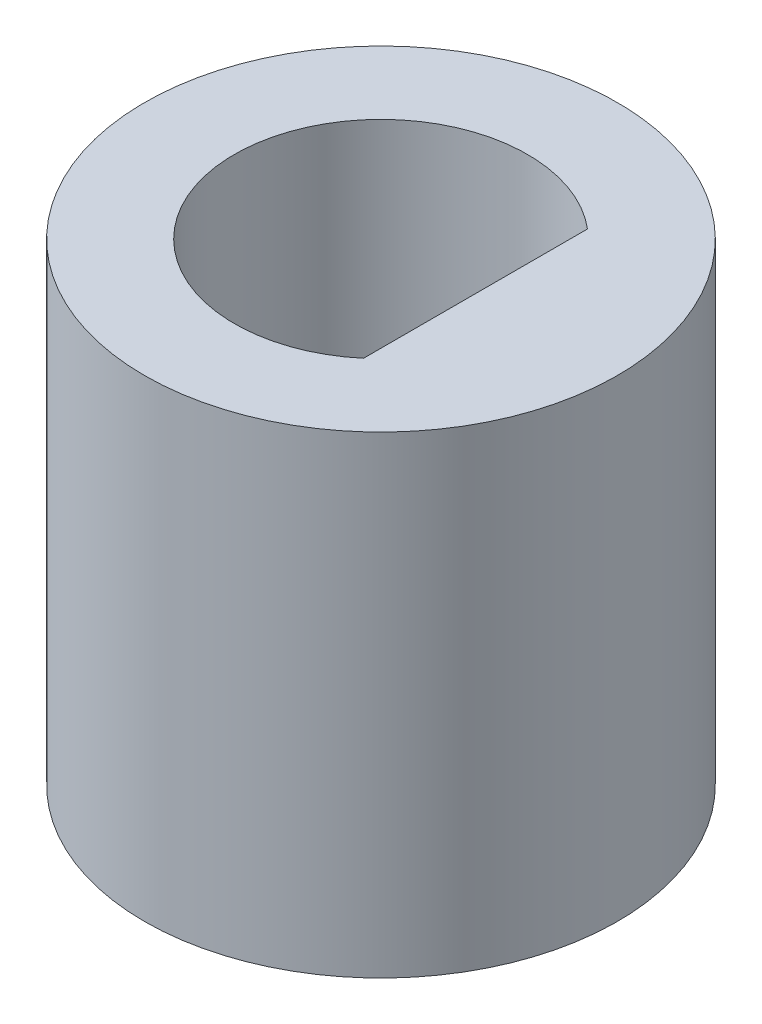
ISO-10303-21;
HEADER;
FILE_DESCRIPTION(('STEP AP214'),'2;1');
FILE_NAME('part.step','',(''),(''),'','','');
FILE_SCHEMA(('AUTOMOTIVE_DESIGN { 1 0 10303 214 1 1 1 1 }'));
ENDSEC;
DATA;
#1=APPLICATION_CONTEXT('core data for automotive mechanical design processes');
#2=APPLICATION_PROTOCOL_DEFINITION('international standard','automotive_design',2000,#1);
#3=PRODUCT_CONTEXT('',#1,'mechanical');
#4=PRODUCT('Part','Part','',(#3));
#5=PRODUCT_RELATED_PRODUCT_CATEGORY('part','',(#4));
#6=PRODUCT_DEFINITION_FORMATION('','',#4);
#7=PRODUCT_DEFINITION_CONTEXT('part definition',#1,'design');
#8=PRODUCT_DEFINITION('design','',#6,#7);
#9=PRODUCT_DEFINITION_SHAPE('','',#8);
#10=(LENGTH_UNIT() NAMED_UNIT(*) SI_UNIT(.MILLI.,.METRE.));
#11=(NAMED_UNIT(*) PLANE_ANGLE_UNIT() SI_UNIT($,.RADIAN.));
#12=(NAMED_UNIT(*) SI_UNIT($,.STERADIAN.) SOLID_ANGLE_UNIT());
#13=UNCERTAINTY_MEASURE_WITH_UNIT(LENGTH_MEASURE(1.E-05),#10,'distance_accuracy_value','');
#14=(GEOMETRIC_REPRESENTATION_CONTEXT(3) GLOBAL_UNCERTAINTY_ASSIGNED_CONTEXT((#13)) GLOBAL_UNIT_ASSIGNED_CONTEXT((#10,
#11,#12)) REPRESENTATION_CONTEXT('',''));
#15=CARTESIAN_POINT('',(0.,0.,0.));
#16=DIRECTION('',(0.,0.,1.));
#17=DIRECTION('',(1.,0.,0.));
#18=AXIS2_PLACEMENT_3D('',#15,#16,#17);
#19=CARTESIAN_POINT('',(0.,-0.25,0.));
#20=DIRECTION('',(0.,1.,0.));
#21=DIRECTION('',(0.,0.,1.));
#22=AXIS2_PLACEMENT_3D('',#19,#20,#21);
#23=PLANE('',#22);
#24=DIRECTION('',(0.,0.,-1.));
#25=VECTOR('',#24,1.);
#26=CARTESIAN_POINT('',(1.,-0.25,0.));
#27=LINE('',#26,#25);
#28=CARTESIAN_POINT('',(1.,-0.25,1.1842719282327));
#29=VERTEX_POINT('',#28);
#30=CARTESIAN_POINT('',(1.,-0.25,0.97979589711327));
#31=VERTEX_POINT('',#30);
#32=EDGE_CURVE('E72',#29,#31,#27,.T.);
#33=ORIENTED_EDGE('',*,*,#32,.F.);
#34=CARTESIAN_POINT('',(0.,-0.25,0.));
#35=DIRECTION('',(0.,1.,0.));
#36=DIRECTION('',(0.,0.,1.));
#37=AXIS2_PLACEMENT_3D('',#34,#35,#36);
#38=CIRCLE('',#37,1.55);
#39=CARTESIAN_POINT('',(1.,-0.25,-1.1842719282327));
#40=VERTEX_POINT('',#39);
#41=EDGE_CURVE('E140',#40,#29,#38,.T.);
#42=ORIENTED_EDGE('',*,*,#41,.F.);
#43=CARTESIAN_POINT('',(1.,-0.25,-0.97979589711327));
#44=VERTEX_POINT('',#43);
#45=EDGE_CURVE('E136',#44,#40,#27,.T.);
#46=ORIENTED_EDGE('',*,*,#45,.F.);
#47=CARTESIAN_POINT('',(0.,-0.25,0.));
#48=DIRECTION('',(0.,1.,0.));
#49=DIRECTION('',(0.,0.,1.));
#50=AXIS2_PLACEMENT_3D('',#47,#48,#49);
#51=CIRCLE('',#50,1.4);
#52=EDGE_CURVE('E145',#44,#31,#51,.T.);
#53=ORIENTED_EDGE('',*,*,#52,.T.);
#54=EDGE_LOOP('',(#33,#42,#46,#53));
#55=FACE_BOUND('',#54,.T.);
#56=ADVANCED_FACE('F49',(#55),#23,.F.);
#57=CARTESIAN_POINT('',(0.,-0.25,0.));
#58=DIRECTION('',(0.,1.,0.));
#59=DIRECTION('',(0.,0.,1.));
#60=AXIS2_PLACEMENT_3D('',#57,#58,#59);
#61=CYLINDRICAL_SURFACE('',#60,1.4);
#62=DIRECTION('',(0.,1.,0.));
#63=VECTOR('',#62,1.);
#64=CARTESIAN_POINT('',(1.,-0.25,-0.97979589711327));
#65=LINE('',#64,#63);
#66=CARTESIAN_POINT('',(1.,0.25,-0.97979589711327));
#67=VERTEX_POINT('',#66);
#68=EDGE_CURVE('E132',#67,#44,#65,.F.);
#69=ORIENTED_EDGE('',*,*,#68,.F.);
#70=CARTESIAN_POINT('',(0.,0.25,0.));
#71=DIRECTION('',(0.,1.,0.));
#72=DIRECTION('',(0.,0.,1.));
#73=AXIS2_PLACEMENT_3D('',#70,#71,#72);
#74=CIRCLE('',#73,1.4);
#75=CARTESIAN_POINT('',(1.,0.25,0.97979589711327));
#76=VERTEX_POINT('',#75);
#77=EDGE_CURVE('E142',#67,#76,#74,.T.);
#78=ORIENTED_EDGE('',*,*,#77,.T.);
#79=DIRECTION('',(0.,1.,0.));
#80=VECTOR('',#79,1.);
#81=CARTESIAN_POINT('',(1.,-0.25,0.97979589711327));
#82=LINE('',#81,#80);
#83=EDGE_CURVE('E138',#31,#76,#82,.T.);
#84=ORIENTED_EDGE('',*,*,#83,.F.);
#85=ORIENTED_EDGE('',*,*,#52,.F.);
#86=EDGE_LOOP('',(#69,#78,#84,#85));
#87=FACE_BOUND('',#86,.T.);
#88=ADVANCED_FACE('F152',(#87),#61,.F.);
#89=CARTESIAN_POINT('',(0.,0.25,0.));
#90=DIRECTION('',(0.,1.,0.));
#91=DIRECTION('',(0.,0.,1.));
#92=AXIS2_PLACEMENT_3D('',#89,#90,#91);
#93=PLANE('',#92);
#94=CARTESIAN_POINT('',(0.,0.25,0.));
#95=DIRECTION('',(0.,1.,0.));
#96=DIRECTION('',(0.,0.,1.));
#97=AXIS2_PLACEMENT_3D('',#94,#95,#96);
#98=CIRCLE('',#97,1.55);
#99=CARTESIAN_POINT('',(1.,0.25,-1.1842719282327));
#100=VERTEX_POINT('',#99);
#101=CARTESIAN_POINT('',(1.,0.25,1.1842719282327));
#102=VERTEX_POINT('',#101);
#103=EDGE_CURVE('E53',#100,#102,#98,.T.);
#104=ORIENTED_EDGE('',*,*,#103,.T.);
#105=DIRECTION('',(0.,0.,-1.));
#106=VECTOR('',#105,1.);
#107=CARTESIAN_POINT('',(1.,0.25,0.));
#108=LINE('',#107,#106);
#109=EDGE_CURVE('E12',#102,#76,#108,.T.);
#110=ORIENTED_EDGE('',*,*,#109,.T.);
#111=ORIENTED_EDGE('',*,*,#77,.F.);
#112=EDGE_CURVE('E58',#67,#100,#108,.T.);
#113=ORIENTED_EDGE('',*,*,#112,.T.);
#114=EDGE_LOOP('',(#104,#110,#111,#113));
#115=FACE_BOUND('',#114,.T.);
#116=ADVANCED_FACE('F149',(#115),#93,.T.);
#117=CARTESIAN_POINT('',(0.,-2.5,0.));
#118=DIRECTION('',(0.,1.,0.));
#119=DIRECTION('',(0.,0.,1.));
#120=AXIS2_PLACEMENT_3D('',#117,#118,#119);
#121=CYLINDRICAL_SURFACE('',#120,1.55);
#122=DIRECTION('',(0.,1.,0.));
#123=VECTOR('',#122,1.);
#124=CARTESIAN_POINT('',(1.,-2.5,-1.1842719282327));
#125=LINE('',#124,#123);
#126=CARTESIAN_POINT('',(1.,-2.5,-1.1842719282327));
#127=VERTEX_POINT('',#126);
#128=EDGE_CURVE('E109',#127,#40,#125,.T.);
#129=ORIENTED_EDGE('',*,*,#128,.T.);
#130=ORIENTED_EDGE('',*,*,#41,.T.);
#131=DIRECTION('',(0.,1.,0.));
#132=VECTOR('',#131,1.);
#133=CARTESIAN_POINT('',(1.,-2.5,1.1842719282327));
#134=LINE('',#133,#132);
#135=CARTESIAN_POINT('',(1.,-2.5,1.1842719282327));
#136=VERTEX_POINT('',#135);
#137=EDGE_CURVE('E131',#136,#29,#134,.T.);
#138=ORIENTED_EDGE('',*,*,#137,.F.);
#139=CARTESIAN_POINT('',(0.,-2.5,0.));
#140=DIRECTION('',(0.,1.,0.));
#141=DIRECTION('',(0.,0.,1.));
#142=AXIS2_PLACEMENT_3D('',#139,#140,#141);
#143=CIRCLE('',#142,1.55);
#144=EDGE_CURVE('E122',#127,#136,#143,.T.);
#145=ORIENTED_EDGE('',*,*,#144,.F.);
#146=EDGE_LOOP('',(#129,#130,#138,#145));
#147=FACE_BOUND('',#146,.T.);
#148=ADVANCED_FACE('F160',(#147),#121,.F.);
#149=CARTESIAN_POINT('',(1.,-2.5,0.));
#150=DIRECTION('',(1.,0.,0.));
#151=DIRECTION('',(0.,0.,-1.));
#152=AXIS2_PLACEMENT_3D('',#149,#150,#151);
#153=PLANE('',#152);
#154=ORIENTED_EDGE('',*,*,#137,.T.);
#155=ORIENTED_EDGE('',*,*,#32,.T.);
#156=ORIENTED_EDGE('',*,*,#83,.T.);
#157=ORIENTED_EDGE('',*,*,#109,.F.);
#158=CARTESIAN_POINT('',(1.,2.5,1.1842719282327));
#159=VERTEX_POINT('',#158);
#160=EDGE_CURVE('E118',#102,#159,#134,.T.);
#161=ORIENTED_EDGE('',*,*,#160,.T.);
#162=DIRECTION('',(0.,0.,-1.));
#163=VECTOR('',#162,1.);
#164=CARTESIAN_POINT('',(1.,2.5,0.));
#165=LINE('',#164,#163);
#166=CARTESIAN_POINT('',(1.,2.5,-1.1842719282327));
#167=VERTEX_POINT('',#166);
#168=EDGE_CURVE('E115',#159,#167,#165,.T.);
#169=ORIENTED_EDGE('',*,*,#168,.T.);
#170=EDGE_CURVE('E65',#100,#167,#125,.T.);
#171=ORIENTED_EDGE('',*,*,#170,.F.);
#172=ORIENTED_EDGE('',*,*,#112,.F.);
#173=ORIENTED_EDGE('',*,*,#68,.T.);
#174=ORIENTED_EDGE('',*,*,#45,.T.);
#175=ORIENTED_EDGE('',*,*,#128,.F.);
#176=DIRECTION('',(0.,0.,-1.));
#177=VECTOR('',#176,1.);
#178=CARTESIAN_POINT('',(1.,-2.5,0.));
#179=LINE('',#178,#177);
#180=EDGE_CURVE('E127',#136,#127,#179,.T.);
#181=ORIENTED_EDGE('',*,*,#180,.F.);
#182=EDGE_LOOP('',(#154,#155,#156,#157,#161,#169,#171,#172,#173,#174,#175,#181));
#183=FACE_BOUND('',#182,.T.);
#184=ADVANCED_FACE('F117',(#183),#153,.F.);
#185=ORIENTED_EDGE('',*,*,#103,.F.);
#186=ORIENTED_EDGE('',*,*,#170,.T.);
#187=CARTESIAN_POINT('',(0.,2.5,0.));
#188=DIRECTION('',(0.,1.,0.));
#189=DIRECTION('',(0.,0.,1.));
#190=AXIS2_PLACEMENT_3D('',#187,#188,#189);
#191=CIRCLE('',#190,1.55);
#192=EDGE_CURVE('E105',#167,#159,#191,.T.);
#193=ORIENTED_EDGE('',*,*,#192,.T.);
#194=ORIENTED_EDGE('',*,*,#160,.F.);
#195=EDGE_LOOP('',(#185,#186,#193,#194));
#196=FACE_BOUND('',#195,.T.);
#197=ADVANCED_FACE('F103',(#196),#121,.F.);
#198=CARTESIAN_POINT('',(0.,-2.5,0.));
#199=DIRECTION('',(0.,1.,0.));
#200=DIRECTION('',(0.,0.,1.));
#201=AXIS2_PLACEMENT_3D('',#198,#199,#200);
#202=PLANE('',#201);
#203=ORIENTED_EDGE('',*,*,#144,.T.);
#204=ORIENTED_EDGE('',*,*,#180,.T.);
#205=EDGE_LOOP('',(#203,#204));
#206=FACE_BOUND('',#205,.T.);
#207=CARTESIAN_POINT('',(0.,-2.5,0.));
#208=DIRECTION('',(0.,1.,0.));
#209=DIRECTION('',(0.,0.,1.));
#210=AXIS2_PLACEMENT_3D('',#207,#208,#209);
#211=CIRCLE('',#210,2.5);
#212=CARTESIAN_POINT('',(0.,-2.5,2.5));
#213=VERTEX_POINT('',#212);
#214=EDGE_CURVE('E110',#213,#213,#211,.T.);
#215=ORIENTED_EDGE('',*,*,#214,.F.);
#216=EDGE_LOOP('',(#215));
#217=FACE_BOUND('',#216,.T.);
#218=ADVANCED_FACE('F163',(#206,#217),#202,.F.);
#219=CARTESIAN_POINT('',(0.,2.5,0.));
#220=DIRECTION('',(0.,1.,0.));
#221=DIRECTION('',(0.,0.,1.));
#222=AXIS2_PLACEMENT_3D('',#219,#220,#221);
#223=PLANE('',#222);
#224=ORIENTED_EDGE('',*,*,#192,.F.);
#225=ORIENTED_EDGE('',*,*,#168,.F.);
#226=EDGE_LOOP('',(#224,#225));
#227=FACE_BOUND('',#226,.T.);
#228=CARTESIAN_POINT('',(0.,2.5,0.));
#229=DIRECTION('',(0.,1.,0.));
#230=DIRECTION('',(0.,0.,1.));
#231=AXIS2_PLACEMENT_3D('',#228,#229,#230);
#232=CIRCLE('',#231,2.5);
#233=CARTESIAN_POINT('',(0.,2.5,2.5));
#234=VERTEX_POINT('',#233);
#235=EDGE_CURVE('E119',#234,#234,#232,.T.);
#236=ORIENTED_EDGE('',*,*,#235,.T.);
#237=EDGE_LOOP('',(#236));
#238=FACE_BOUND('',#237,.T.);
#239=ADVANCED_FACE('F113',(#227,#238),#223,.T.);
#240=CARTESIAN_POINT('',(0.,-0.25,0.));
#241=DIRECTION('',(0.,1.,0.));
#242=DIRECTION('',(0.,0.,1.));
#243=AXIS2_PLACEMENT_3D('',#240,#241,#242);
#244=CYLINDRICAL_SURFACE('',#243,2.5);
#245=ORIENTED_EDGE('',*,*,#235,.F.);
#246=EDGE_LOOP('',(#245));
#247=FACE_BOUND('',#246,.T.);
#248=ORIENTED_EDGE('',*,*,#214,.T.);
#249=EDGE_LOOP('',(#248));
#250=FACE_BOUND('',#249,.T.);
#251=ADVANCED_FACE('F51',(#247,#250),#244,.T.);
#252=CLOSED_SHELL('',(#56,#88,#116,#148,#184,#197,#218,#239,#251));
#253=MANIFOLD_SOLID_BREP('B2',#252);
#254=ADVANCED_BREP_SHAPE_REPRESENTATION('',(#18,#253),#14);
#255=SHAPE_DEFINITION_REPRESENTATION(#9,#254);
ENDSEC;
END-ISO-10303-21;
